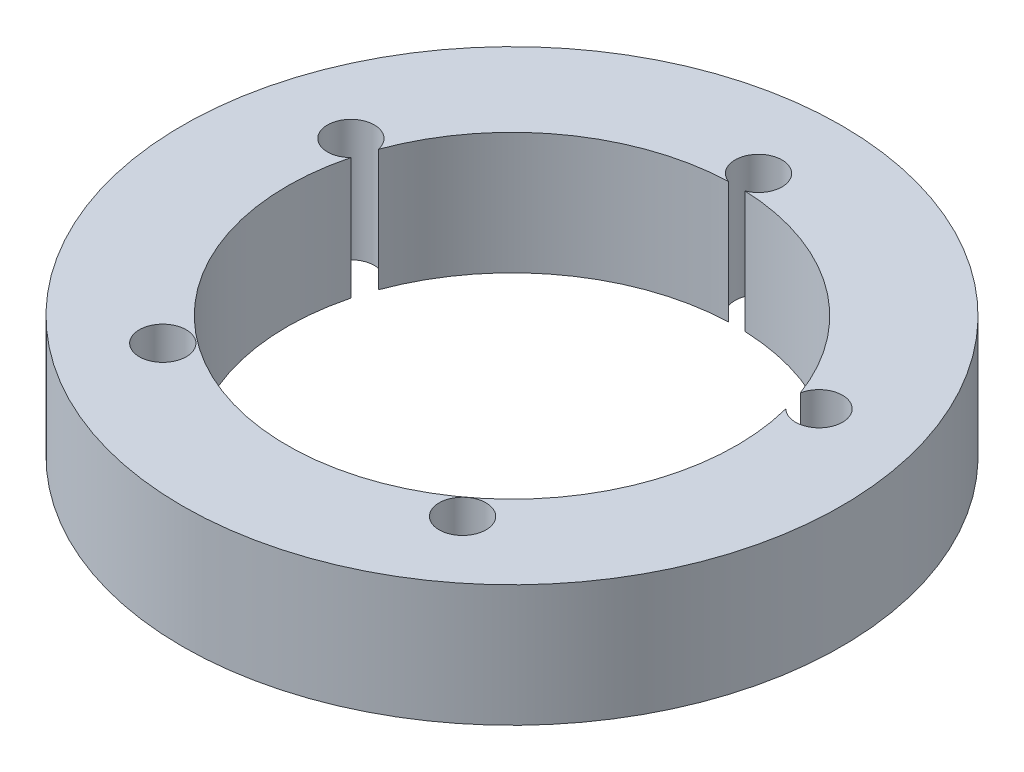
ISO-10303-21;
HEADER;
FILE_DESCRIPTION(('STEP AP214'),'2;1');
FILE_NAME('part.step','',(''),(''),'','','');
FILE_SCHEMA(('AUTOMOTIVE_DESIGN { 1 0 10303 214 1 1 1 1 }'));
ENDSEC;
DATA;
#1=APPLICATION_CONTEXT('core data for automotive mechanical design processes');
#2=APPLICATION_PROTOCOL_DEFINITION('international standard','automotive_design',2000,#1);
#3=PRODUCT_CONTEXT('',#1,'mechanical');
#4=PRODUCT('Part','Part','',(#3));
#5=PRODUCT_RELATED_PRODUCT_CATEGORY('part','',(#4));
#6=PRODUCT_DEFINITION_FORMATION('','',#4);
#7=PRODUCT_DEFINITION_CONTEXT('part definition',#1,'design');
#8=PRODUCT_DEFINITION('design','',#6,#7);
#9=PRODUCT_DEFINITION_SHAPE('','',#8);
#10=(LENGTH_UNIT() NAMED_UNIT(*) SI_UNIT(.MILLI.,.METRE.));
#11=(NAMED_UNIT(*) PLANE_ANGLE_UNIT() SI_UNIT($,.RADIAN.));
#12=(NAMED_UNIT(*) SI_UNIT($,.STERADIAN.) SOLID_ANGLE_UNIT());
#13=UNCERTAINTY_MEASURE_WITH_UNIT(LENGTH_MEASURE(1.E-05),#10,'distance_accuracy_value','');
#14=(GEOMETRIC_REPRESENTATION_CONTEXT(3) GLOBAL_UNCERTAINTY_ASSIGNED_CONTEXT((#13)) GLOBAL_UNIT_ASSIGNED_CONTEXT((#10,
#11,#12)) REPRESENTATION_CONTEXT('',''));
#15=CARTESIAN_POINT('',(0.,0.,0.));
#16=DIRECTION('',(0.,0.,1.));
#17=DIRECTION('',(1.,0.,0.));
#18=AXIS2_PLACEMENT_3D('',#15,#16,#17);
#19=CARTESIAN_POINT('',(0.,13.,0.));
#20=DIRECTION('',(0.,-1.,0.));
#21=DIRECTION('',(0.,0.,-1.));
#22=AXIS2_PLACEMENT_3D('',#19,#20,#21);
#23=CYLINDRICAL_SURFACE('',#22,24.);
#24=DIRECTION('',(0.,1.,0.));
#25=VECTOR('',#24,1.);
#26=CARTESIAN_POINT('',(23.2330221362673,5.,-6.01886055792263));
#27=LINE('',#26,#25);
#28=CARTESIAN_POINT('',(23.2330221362672,0.,-6.01886055792261));
#29=VERTEX_POINT('',#28);
#30=CARTESIAN_POINT('',(23.2330221362673,13.,-6.01886055792262));
#31=VERTEX_POINT('',#30);
#32=EDGE_CURVE('E92',#29,#31,#27,.T.);
#33=ORIENTED_EDGE('',*,*,#32,.F.);
#34=CARTESIAN_POINT('',(0.,0.,0.));
#35=DIRECTION('',(0.,1.,0.));
#36=DIRECTION('',(0.,0.,1.));
#37=AXIS2_PLACEMENT_3D('',#34,#35,#36);
#38=CIRCLE('',#37,24.);
#39=CARTESIAN_POINT('',(-23.2330221367583,0.,-6.01886055602694));
#40=VERTEX_POINT('',#39);
#41=EDGE_CURVE('E116',#40,#29,#38,.T.);
#42=ORIENTED_EDGE('',*,*,#41,.F.);
#43=DIRECTION('',(0.,1.,0.));
#44=VECTOR('',#43,1.);
#45=CARTESIAN_POINT('',(-23.2330221367584,5.,-6.01886055602696));
#46=LINE('',#45,#44);
#47=CARTESIAN_POINT('',(-23.2330221367584,13.,-6.01886055602696));
#48=VERTEX_POINT('',#47);
#49=EDGE_CURVE('E61',#48,#40,#46,.F.);
#50=ORIENTED_EDGE('',*,*,#49,.F.);
#51=CARTESIAN_POINT('',(0.,13.,0.));
#52=DIRECTION('',(0.,1.,0.));
#53=DIRECTION('',(0.,0.,1.));
#54=AXIS2_PLACEMENT_3D('',#51,#52,#53);
#55=CIRCLE('',#54,24.);
#56=EDGE_CURVE('E111',#48,#31,#55,.T.);
#57=ORIENTED_EDGE('',*,*,#56,.T.);
#58=EDGE_LOOP('',(#33,#42,#50,#57));
#59=FACE_BOUND('',#58,.T.);
#60=ADVANCED_FACE('F39',(#59),#23,.F.);
#61=DIRECTION('',(0.,1.,0.));
#62=VECTOR('',#61,1.);
#63=CARTESIAN_POINT('',(-22.5370018019443,5.,-8.2512756455689));
#64=LINE('',#63,#62);
#65=CARTESIAN_POINT('',(-22.5370018019443,0.,-8.25127564556891));
#66=VERTEX_POINT('',#65);
#67=CARTESIAN_POINT('',(-22.5370018019443,13.,-8.2512756455689));
#68=VERTEX_POINT('',#67);
#69=EDGE_CURVE('E159',#66,#68,#64,.T.);
#70=ORIENTED_EDGE('',*,*,#69,.F.);
#71=CARTESIAN_POINT('',(-0.87606659845315,0.,-23.984005239223));
#72=VERTEX_POINT('',#71);
#73=EDGE_CURVE('E112',#72,#66,#38,.T.);
#74=ORIENTED_EDGE('',*,*,#73,.F.);
#75=DIRECTION('',(0.,-1.,0.));
#76=VECTOR('',#75,1.);
#77=CARTESIAN_POINT('',(-0.876066598453191,8.,-23.984005239223));
#78=LINE('',#77,#76);
#79=CARTESIAN_POINT('',(-0.876066598453185,13.,-23.984005239223));
#80=VERTEX_POINT('',#79);
#81=EDGE_CURVE('E130',#72,#80,#78,.F.);
#82=ORIENTED_EDGE('',*,*,#81,.T.);
#83=EDGE_CURVE('E114',#80,#68,#55,.T.);
#84=ORIENTED_EDGE('',*,*,#83,.T.);
#85=EDGE_LOOP('',(#70,#74,#82,#84));
#86=FACE_BOUND('',#85,.T.);
#87=ADVANCED_FACE('F166',(#86),#23,.F.);
#88=DIRECTION('',(0.,1.,0.));
#89=VECTOR('',#88,1.);
#90=CARTESIAN_POINT('',(22.5370018028747,5.,-8.25127564302771));
#91=LINE('',#90,#89);
#92=CARTESIAN_POINT('',(22.5370018028747,13.,-8.25127564302771));
#93=VERTEX_POINT('',#92);
#94=CARTESIAN_POINT('',(22.5370018028747,0.,-8.25127564302771));
#95=VERTEX_POINT('',#94);
#96=EDGE_CURVE('E54',#93,#95,#91,.F.);
#97=ORIENTED_EDGE('',*,*,#96,.F.);
#98=CARTESIAN_POINT('',(0.876066598453182,13.,-23.984005239223));
#99=VERTEX_POINT('',#98);
#100=EDGE_CURVE('E102',#93,#99,#55,.T.);
#101=ORIENTED_EDGE('',*,*,#100,.T.);
#102=DIRECTION('',(0.,-1.,0.));
#103=VECTOR('',#102,1.);
#104=CARTESIAN_POINT('',(0.876066598453175,8.,-23.984005239223));
#105=LINE('',#104,#103);
#106=CARTESIAN_POINT('',(0.876066598453134,0.,-23.984005239223));
#107=VERTEX_POINT('',#106);
#108=EDGE_CURVE('E134',#99,#107,#105,.T.);
#109=ORIENTED_EDGE('',*,*,#108,.T.);
#110=EDGE_CURVE('E104',#95,#107,#38,.T.);
#111=ORIENTED_EDGE('',*,*,#110,.F.);
#112=EDGE_LOOP('',(#97,#101,#109,#111));
#113=FACE_BOUND('',#112,.T.);
#114=ADVANCED_FACE('F100',(#113),#23,.F.);
#115=CARTESIAN_POINT('',(0.,13.,0.));
#116=DIRECTION('',(0.,1.,0.));
#117=DIRECTION('',(0.,0.,1.));
#118=AXIS2_PLACEMENT_3D('',#115,#116,#117);
#119=PLANE('',#118);
#120=CARTESIAN_POINT('',(25.0000000007018,13.,-7.7944771343823));
#121=DIRECTION('',(0.,1.,0.));
#122=DIRECTION('',(0.,0.,1.));
#123=AXIS2_PLACEMENT_3D('',#120,#121,#122);
#124=CIRCLE('',#123,2.505);
#125=EDGE_CURVE('E89',#31,#93,#124,.T.);
#126=ORIENTED_EDGE('',*,*,#125,.F.);
#127=ORIENTED_EDGE('',*,*,#56,.F.);
#128=CARTESIAN_POINT('',(-24.9999999992982,13.,-7.7944771343721));
#129=DIRECTION('',(0.,1.,0.));
#130=DIRECTION('',(0.,0.,1.));
#131=AXIS2_PLACEMENT_3D('',#128,#129,#130);
#132=CIRCLE('',#131,2.505);
#133=EDGE_CURVE('E162',#68,#48,#132,.T.);
#134=ORIENTED_EDGE('',*,*,#133,.F.);
#135=ORIENTED_EDGE('',*,*,#83,.F.);
#136=CARTESIAN_POINT('',(0.,13.,-26.3308184646576));
#137=DIRECTION('',(0.,1.,0.));
#138=DIRECTION('',(0.,0.,1.));
#139=AXIS2_PLACEMENT_3D('',#136,#137,#138);
#140=CIRCLE('',#139,2.505);
#141=EDGE_CURVE('E110',#80,#99,#140,.F.);
#142=ORIENTED_EDGE('',*,*,#141,.T.);
#143=ORIENTED_EDGE('',*,*,#100,.F.);
#144=EDGE_LOOP('',(#126,#127,#134,#135,#142,#143));
#145=FACE_BOUND('',#144,.T.);
#146=CARTESIAN_POINT('',(15.9168548232636,13.,21.1952208137044));
#147=DIRECTION('',(0.,1.,0.));
#148=DIRECTION('',(0.,0.,1.));
#149=AXIS2_PLACEMENT_3D('',#146,#147,#148);
#150=CIRCLE('',#149,2.505);
#151=CARTESIAN_POINT('',(15.9168548232636,13.,23.7002208137044));
#152=VERTEX_POINT('',#151);
#153=EDGE_CURVE('E143',#152,#152,#150,.T.);
#154=ORIENTED_EDGE('',*,*,#153,.F.);
#155=EDGE_LOOP('',(#154));
#156=FACE_BOUND('',#155,.T.);
#157=CARTESIAN_POINT('',(-16.1031451767364,13.,21.1952208137044));
#158=DIRECTION('',(0.,1.,0.));
#159=DIRECTION('',(0.,0.,1.));
#160=AXIS2_PLACEMENT_3D('',#157,#158,#159);
#161=CIRCLE('',#160,2.505);
#162=CARTESIAN_POINT('',(-16.1031451767364,13.,23.7002208137044));
#163=VERTEX_POINT('',#162);
#164=EDGE_CURVE('E140',#163,#163,#161,.T.);
#165=ORIENTED_EDGE('',*,*,#164,.F.);
#166=EDGE_LOOP('',(#165));
#167=FACE_BOUND('',#166,.T.);
#168=CARTESIAN_POINT('',(0.,13.,0.));
#169=DIRECTION('',(0.,1.,0.));
#170=DIRECTION('',(1.,0.,0.));
#171=AXIS2_PLACEMENT_3D('',#168,#169,#170);
#172=CIRCLE('',#171,35.2);
#173=CARTESIAN_POINT('',(0.,13.,-35.2));
#174=VERTEX_POINT('',#173);
#175=EDGE_CURVE('E125',#174,#174,#172,.T.);
#176=ORIENTED_EDGE('',*,*,#175,.T.);
#177=EDGE_LOOP('',(#176));
#178=FACE_BOUND('',#177,.T.);
#179=ADVANCED_FACE('F107',(#145,#156,#167,#178),#119,.T.);
#180=CARTESIAN_POINT('',(0.,0.,0.));
#181=DIRECTION('',(0.,1.,0.));
#182=DIRECTION('',(0.,0.,1.));
#183=AXIS2_PLACEMENT_3D('',#180,#181,#182);
#184=PLANE('',#183);
#185=CARTESIAN_POINT('',(15.9168548232636,0.,21.1952208137044));
#186=DIRECTION('',(0.,1.,0.));
#187=DIRECTION('',(0.,0.,1.));
#188=AXIS2_PLACEMENT_3D('',#185,#186,#187);
#189=CIRCLE('',#188,2.505);
#190=CARTESIAN_POINT('',(15.9168548232636,0.,23.7002208137044));
#191=VERTEX_POINT('',#190);
#192=EDGE_CURVE('E141',#191,#191,#189,.T.);
#193=ORIENTED_EDGE('',*,*,#192,.T.);
#194=EDGE_LOOP('',(#193));
#195=FACE_BOUND('',#194,.T.);
#196=CARTESIAN_POINT('',(-16.1031451767364,0.,21.1952208137044));
#197=DIRECTION('',(0.,1.,0.));
#198=DIRECTION('',(0.,0.,1.));
#199=AXIS2_PLACEMENT_3D('',#196,#197,#198);
#200=CIRCLE('',#199,2.505);
#201=CARTESIAN_POINT('',(-16.1031451767364,0.,23.7002208137044));
#202=VERTEX_POINT('',#201);
#203=EDGE_CURVE('E136',#202,#202,#200,.T.);
#204=ORIENTED_EDGE('',*,*,#203,.T.);
#205=EDGE_LOOP('',(#204));
#206=FACE_BOUND('',#205,.T.);
#207=ORIENTED_EDGE('',*,*,#41,.T.);
#208=CARTESIAN_POINT('',(25.0000000007018,0.,-7.7944771343823));
#209=DIRECTION('',(0.,1.,0.));
#210=DIRECTION('',(0.,0.,1.));
#211=AXIS2_PLACEMENT_3D('',#208,#209,#210);
#212=CIRCLE('',#211,2.505);
#213=EDGE_CURVE('E12',#29,#95,#212,.T.);
#214=ORIENTED_EDGE('',*,*,#213,.T.);
#215=ORIENTED_EDGE('',*,*,#110,.T.);
#216=CARTESIAN_POINT('',(0.,0.,-26.3308184646576));
#217=DIRECTION('',(0.,1.,0.));
#218=DIRECTION('',(0.,0.,1.));
#219=AXIS2_PLACEMENT_3D('',#216,#217,#218);
#220=CIRCLE('',#219,2.505);
#221=EDGE_CURVE('E139',#107,#72,#220,.T.);
#222=ORIENTED_EDGE('',*,*,#221,.T.);
#223=ORIENTED_EDGE('',*,*,#73,.T.);
#224=CARTESIAN_POINT('',(-24.9999999992982,0.,-7.7944771343721));
#225=DIRECTION('',(0.,1.,0.));
#226=DIRECTION('',(0.,0.,1.));
#227=AXIS2_PLACEMENT_3D('',#224,#225,#226);
#228=CIRCLE('',#227,2.505);
#229=EDGE_CURVE('E47',#66,#40,#228,.T.);
#230=ORIENTED_EDGE('',*,*,#229,.T.);
#231=EDGE_LOOP('',(#207,#214,#215,#222,#223,#230));
#232=FACE_BOUND('',#231,.T.);
#233=CARTESIAN_POINT('',(0.,0.,0.));
#234=DIRECTION('',(0.,1.,0.));
#235=DIRECTION('',(1.,0.,0.));
#236=AXIS2_PLACEMENT_3D('',#233,#234,#235);
#237=CIRCLE('',#236,35.2);
#238=CARTESIAN_POINT('',(0.,0.,-35.2));
#239=VERTEX_POINT('',#238);
#240=EDGE_CURVE('E120',#239,#239,#237,.T.);
#241=ORIENTED_EDGE('',*,*,#240,.F.);
#242=EDGE_LOOP('',(#241));
#243=FACE_BOUND('',#242,.T.);
#244=ADVANCED_FACE('F147',(#195,#206,#232,#243),#184,.F.);
#245=CARTESIAN_POINT('',(0.,13.,0.));
#246=DIRECTION('',(0.,-1.,0.));
#247=DIRECTION('',(0.,0.,-1.));
#248=AXIS2_PLACEMENT_3D('',#245,#246,#247);
#249=CYLINDRICAL_SURFACE('',#248,35.2);
#250=CARTESIAN_POINT('',(0.,13.,-35.2));
#251=CARTESIAN_POINT('',(0.,12.8645833333333,-35.2));
#252=CARTESIAN_POINT('',(0.,12.7291666666667,-35.2));
#253=CARTESIAN_POINT('',(0.,12.4583333333333,-35.2));
#254=CARTESIAN_POINT('',(0.,12.3229166666667,-35.2));
#255=CARTESIAN_POINT('',(0.,12.0520833333333,-35.2));
#256=CARTESIAN_POINT('',(0.,11.9166666666667,-35.2));
#257=CARTESIAN_POINT('',(0.,11.6458333333333,-35.2));
#258=CARTESIAN_POINT('',(0.,11.5104166666667,-35.2));
#259=CARTESIAN_POINT('',(0.,11.2395833333333,-35.2));
#260=CARTESIAN_POINT('',(0.,11.1041666666667,-35.2));
#261=CARTESIAN_POINT('',(0.,10.8333333333333,-35.2));
#262=CARTESIAN_POINT('',(0.,10.6979166666667,-35.2));
#263=CARTESIAN_POINT('',(0.,10.4270833333333,-35.2));
#264=CARTESIAN_POINT('',(0.,10.2916666666667,-35.2));
#265=CARTESIAN_POINT('',(0.,10.0208333333333,-35.2));
#266=CARTESIAN_POINT('',(0.,9.88541666666667,-35.2));
#267=CARTESIAN_POINT('',(0.,9.61458333333333,-35.2));
#268=CARTESIAN_POINT('',(0.,9.47916666666667,-35.2));
#269=CARTESIAN_POINT('',(0.,9.20833333333333,-35.2));
#270=CARTESIAN_POINT('',(0.,9.07291666666666,-35.2));
#271=CARTESIAN_POINT('',(0.,8.80208333333333,-35.2));
#272=CARTESIAN_POINT('',(0.,8.66666666666667,-35.2));
#273=CARTESIAN_POINT('',(0.,8.39583333333333,-35.2));
#274=CARTESIAN_POINT('',(0.,8.26041666666667,-35.2));
#275=CARTESIAN_POINT('',(0.,7.98958333333333,-35.2));
#276=CARTESIAN_POINT('',(0.,7.85416666666667,-35.2));
#277=CARTESIAN_POINT('',(0.,7.58333333333333,-35.2));
#278=CARTESIAN_POINT('',(0.,7.44791666666667,-35.2));
#279=CARTESIAN_POINT('',(0.,7.17708333333333,-35.2));
#280=CARTESIAN_POINT('',(0.,7.04166666666667,-35.2));
#281=CARTESIAN_POINT('',(0.,6.77083333333333,-35.2));
#282=CARTESIAN_POINT('',(0.,6.63541666666667,-35.2));
#283=CARTESIAN_POINT('',(0.,6.36458333333333,-35.2));
#284=CARTESIAN_POINT('',(0.,6.22916666666667,-35.2));
#285=CARTESIAN_POINT('',(0.,5.95833333333333,-35.2));
#286=CARTESIAN_POINT('',(0.,5.82291666666667,-35.2));
#287=CARTESIAN_POINT('',(0.,5.55208333333333,-35.2));
#288=CARTESIAN_POINT('',(0.,5.41666666666667,-35.2));
#289=CARTESIAN_POINT('',(0.,5.14583333333333,-35.2));
#290=CARTESIAN_POINT('',(0.,5.01041666666667,-35.2));
#291=CARTESIAN_POINT('',(0.,4.73958333333333,-35.2));
#292=CARTESIAN_POINT('',(0.,4.60416666666667,-35.2));
#293=CARTESIAN_POINT('',(0.,4.33333333333333,-35.2));
#294=CARTESIAN_POINT('',(0.,4.19791666666667,-35.2));
#295=CARTESIAN_POINT('',(0.,3.92708333333333,-35.2));
#296=CARTESIAN_POINT('',(0.,3.79166666666667,-35.2));
#297=CARTESIAN_POINT('',(0.,3.52083333333333,-35.2));
#298=CARTESIAN_POINT('',(0.,3.38541666666667,-35.2));
#299=CARTESIAN_POINT('',(0.,3.11458333333333,-35.2));
#300=CARTESIAN_POINT('',(0.,2.97916666666667,-35.2));
#301=CARTESIAN_POINT('',(0.,2.70833333333333,-35.2));
#302=CARTESIAN_POINT('',(0.,2.57291666666667,-35.2));
#303=CARTESIAN_POINT('',(0.,2.30208333333333,-35.2));
#304=CARTESIAN_POINT('',(0.,2.16666666666667,-35.2));
#305=CARTESIAN_POINT('',(0.,1.89583333333333,-35.2));
#306=CARTESIAN_POINT('',(0.,1.76041666666667,-35.2));
#307=CARTESIAN_POINT('',(0.,1.48958333333333,-35.2));
#308=CARTESIAN_POINT('',(0.,1.35416666666667,-35.2));
#309=CARTESIAN_POINT('',(0.,1.08333333333333,-35.2));
#310=CARTESIAN_POINT('',(0.,0.947916666666667,-35.2));
#311=CARTESIAN_POINT('',(0.,0.677083333333334,-35.2));
#312=CARTESIAN_POINT('',(0.,0.541666666666667,-35.2));
#313=CARTESIAN_POINT('',(0.,0.270833333333334,-35.2));
#314=CARTESIAN_POINT('',(0.,0.135416666666667,-35.2));
#315=CARTESIAN_POINT('',(0.,0.,-35.2));
#316=B_SPLINE_CURVE_WITH_KNOTS('',3,(#250,#251,#252,#253,#254,#255,#256,#257,#258,#259,#260,
#261,#262,#263,#264,#265,#266,#267,#268,#269,#270,#271,#272,#273,#274,#275,#276,#277,#278,#279,
#280,#281,#282,#283,#284,#285,#286,#287,#288,#289,#290,#291,#292,#293,#294,#295,#296,#297,#298,
#299,#300,#301,#302,#303,#304,#305,#306,#307,#308,#309,#310,#311,#312,#313,#314,#315),
.UNSPECIFIED.,.F.,.F.,(4,2,2,2,2,2,2,2,2,2,2,2,2,2,2,2,2,2,2,2,2,2,2,2,2,2,2,2,2,2,2,2,4),(0.,
0.40625,0.812500000000001,1.21875,1.625,2.03125,2.4375,2.84375,3.25,3.65625,4.0625,4.46875,
4.875,5.28125,5.6875,6.09375,6.5,6.90625,7.3125,7.71875,8.125,8.53125,8.9375,9.34375,9.75,
10.15625,10.5625,10.96875,11.375,11.78125,12.1875,12.59375,13.),.UNSPECIFIED.);
#317=EDGE_CURVE('BSEAM41',#174,#239,#316,.T.);
#318=ORIENTED_EDGE('',*,*,#175,.F.);
#319=ORIENTED_EDGE('',*,*,#240,.T.);
#320=ORIENTED_EDGE('',*,*,#317,.T.);
#321=ORIENTED_EDGE('',*,*,#317,.F.);
#322=EDGE_LOOP('',(#318,#320,#319,#321));
#323=FACE_BOUND('',#322,.T.);
#324=ADVANCED_FACE('F41',(#323),#249,.T.);
#325=CARTESIAN_POINT('',(0.,16.,-26.3308184646576));
#326=DIRECTION('',(0.,-1.,0.));
#327=DIRECTION('',(0.,0.,-1.));
#328=AXIS2_PLACEMENT_3D('',#325,#326,#327);
#329=CYLINDRICAL_SURFACE('',#328,2.505);
#330=ORIENTED_EDGE('',*,*,#141,.F.);
#331=ORIENTED_EDGE('',*,*,#81,.F.);
#332=ORIENTED_EDGE('',*,*,#221,.F.);
#333=ORIENTED_EDGE('',*,*,#108,.F.);
#334=EDGE_LOOP('',(#330,#331,#332,#333));
#335=FACE_BOUND('',#334,.T.);
#336=ADVANCED_FACE('F168',(#335),#329,.F.);
#337=CARTESIAN_POINT('',(-16.1031451767364,-3.,21.1952208137044));
#338=DIRECTION('',(0.,1.,0.));
#339=DIRECTION('',(0.,0.,1.));
#340=AXIS2_PLACEMENT_3D('',#337,#338,#339);
#341=CYLINDRICAL_SURFACE('',#340,2.505);
#342=ORIENTED_EDGE('',*,*,#164,.T.);
#343=EDGE_LOOP('',(#342));
#344=FACE_BOUND('',#343,.T.);
#345=ORIENTED_EDGE('',*,*,#203,.F.);
#346=EDGE_LOOP('',(#345));
#347=FACE_BOUND('',#346,.T.);
#348=ADVANCED_FACE('F170',(#344,#347),#341,.F.);
#349=CARTESIAN_POINT('',(15.9168548232636,-3.,21.1952208137044));
#350=DIRECTION('',(0.,1.,0.));
#351=DIRECTION('',(0.,0.,1.));
#352=AXIS2_PLACEMENT_3D('',#349,#350,#351);
#353=CYLINDRICAL_SURFACE('',#352,2.505);
#354=ORIENTED_EDGE('',*,*,#153,.T.);
#355=EDGE_LOOP('',(#354));
#356=FACE_BOUND('',#355,.T.);
#357=ORIENTED_EDGE('',*,*,#192,.F.);
#358=EDGE_LOOP('',(#357));
#359=FACE_BOUND('',#358,.T.);
#360=ADVANCED_FACE('F176',(#356,#359),#353,.F.);
#361=CARTESIAN_POINT('',(-24.9999999992982,-3.,-7.7944771343721));
#362=DIRECTION('',(0.,1.,0.));
#363=DIRECTION('',(0.,0.,1.));
#364=AXIS2_PLACEMENT_3D('',#361,#362,#363);
#365=CYLINDRICAL_SURFACE('',#364,2.505);
#366=ORIENTED_EDGE('',*,*,#69,.T.);
#367=ORIENTED_EDGE('',*,*,#133,.T.);
#368=ORIENTED_EDGE('',*,*,#49,.T.);
#369=ORIENTED_EDGE('',*,*,#229,.F.);
#370=EDGE_LOOP('',(#366,#367,#368,#369));
#371=FACE_BOUND('',#370,.T.);
#372=ADVANCED_FACE('F165',(#371),#365,.F.);
#373=CARTESIAN_POINT('',(25.0000000007018,-3.,-7.7944771343823));
#374=DIRECTION('',(0.,1.,0.));
#375=DIRECTION('',(0.,0.,1.));
#376=AXIS2_PLACEMENT_3D('',#373,#374,#375);
#377=CYLINDRICAL_SURFACE('',#376,2.505);
#378=ORIENTED_EDGE('',*,*,#32,.T.);
#379=ORIENTED_EDGE('',*,*,#125,.T.);
#380=ORIENTED_EDGE('',*,*,#96,.T.);
#381=ORIENTED_EDGE('',*,*,#213,.F.);
#382=EDGE_LOOP('',(#378,#379,#380,#381));
#383=FACE_BOUND('',#382,.T.);
#384=ADVANCED_FACE('F90',(#383),#377,.F.);
#385=CLOSED_SHELL('',(#60,#87,#114,#179,#244,#324,#336,#348,#360,#372,#384));
#386=MANIFOLD_SOLID_BREP('B2',#385);
#387=ADVANCED_BREP_SHAPE_REPRESENTATION('',(#18,#386),#14);
#388=SHAPE_DEFINITION_REPRESENTATION(#9,#387);
ENDSEC;
END-ISO-10303-21;
